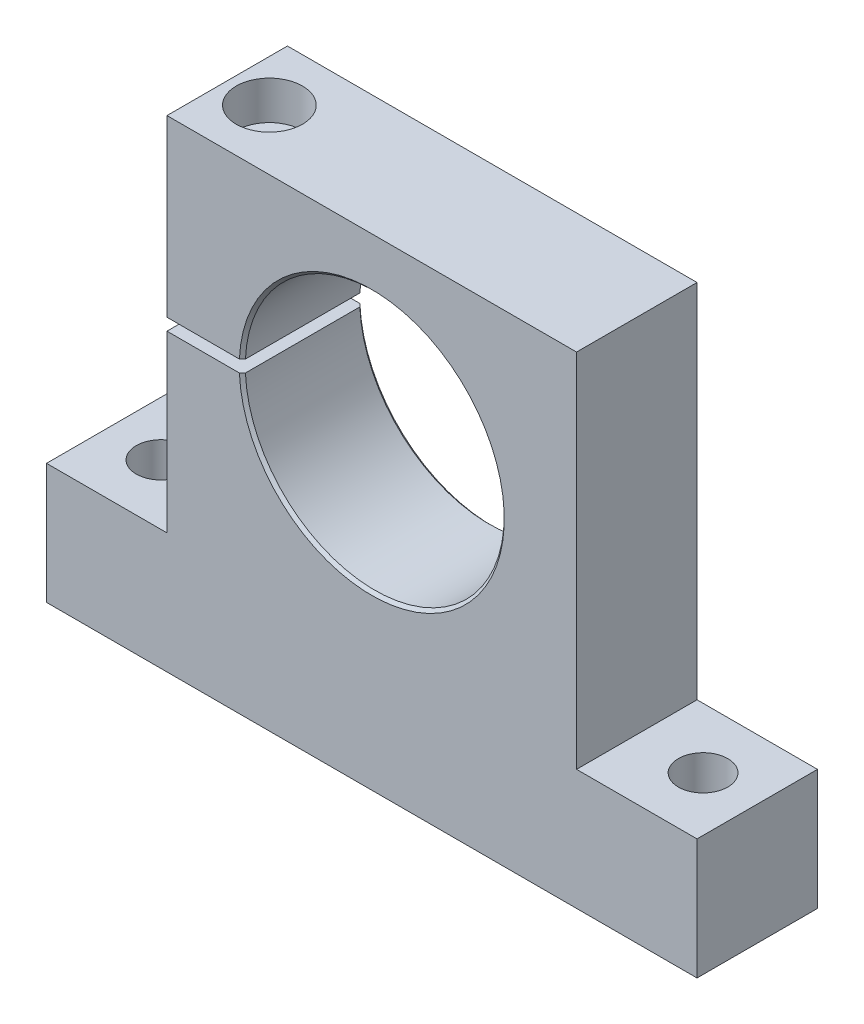
ISO-10303-21;
HEADER;
FILE_DESCRIPTION(('STEP AP214'),'2;1');
FILE_NAME('part.step','',(''),(''),'','','');
FILE_SCHEMA(('AUTOMOTIVE_DESIGN { 1 0 10303 214 1 1 1 1 }'));
ENDSEC;
DATA;
#1=APPLICATION_CONTEXT('core data for automotive mechanical design processes');
#2=APPLICATION_PROTOCOL_DEFINITION('international standard','automotive_design',2000,#1);
#3=PRODUCT_CONTEXT('',#1,'mechanical');
#4=PRODUCT('Part','Part','',(#3));
#5=PRODUCT_RELATED_PRODUCT_CATEGORY('part','',(#4));
#6=PRODUCT_DEFINITION_FORMATION('','',#4);
#7=PRODUCT_DEFINITION_CONTEXT('part definition',#1,'design');
#8=PRODUCT_DEFINITION('design','',#6,#7);
#9=PRODUCT_DEFINITION_SHAPE('','',#8);
#10=(LENGTH_UNIT() NAMED_UNIT(*) SI_UNIT(.MILLI.,.METRE.));
#11=(NAMED_UNIT(*) PLANE_ANGLE_UNIT() SI_UNIT($,.RADIAN.));
#12=(NAMED_UNIT(*) SI_UNIT($,.STERADIAN.) SOLID_ANGLE_UNIT());
#13=UNCERTAINTY_MEASURE_WITH_UNIT(LENGTH_MEASURE(1.E-05),#10,'distance_accuracy_value','');
#14=(GEOMETRIC_REPRESENTATION_CONTEXT(3) GLOBAL_UNCERTAINTY_ASSIGNED_CONTEXT((#13)) GLOBAL_UNIT_ASSIGNED_CONTEXT((#10,
#11,#12)) REPRESENTATION_CONTEXT('',''));
#15=CARTESIAN_POINT('',(0.,0.,0.));
#16=DIRECTION('',(0.,0.,1.));
#17=DIRECTION('',(1.,0.,0.));
#18=AXIS2_PLACEMENT_3D('',#15,#16,#17);
#19=CARTESIAN_POINT('',(20.,20.,20.));
#20=DIRECTION('',(1.,0.,0.));
#21=DIRECTION('',(0.,0.,-1.));
#22=AXIS2_PLACEMENT_3D('',#19,#20,#21);
#23=PLANE('',#22);
#24=DIRECTION('',(0.,-1.,0.));
#25=VECTOR('',#24,1.);
#26=CARTESIAN_POINT('',(20.,20.,0.));
#27=LINE('',#26,#25);
#28=CARTESIAN_POINT('',(20.,80.,0.));
#29=VERTEX_POINT('',#28);
#30=CARTESIAN_POINT('',(20.,51.,0.));
#31=VERTEX_POINT('',#30);
#32=EDGE_CURVE('E165',#29,#31,#27,.T.);
#33=ORIENTED_EDGE('',*,*,#32,.T.);
#34=DIRECTION('',(0.,0.,1.));
#35=VECTOR('',#34,1.);
#36=CARTESIAN_POINT('',(20.,51.,20.));
#37=LINE('',#36,#35);
#38=CARTESIAN_POINT('',(20.,51.,20.));
#39=VERTEX_POINT('',#38);
#40=EDGE_CURVE('E249',#31,#39,#37,.T.);
#41=ORIENTED_EDGE('',*,*,#40,.T.);
#42=DIRECTION('',(0.,-1.,0.));
#43=VECTOR('',#42,1.);
#44=CARTESIAN_POINT('',(20.,20.,20.));
#45=LINE('',#44,#43);
#46=CARTESIAN_POINT('',(20.,80.,20.));
#47=VERTEX_POINT('',#46);
#48=EDGE_CURVE('E295',#47,#39,#45,.T.);
#49=ORIENTED_EDGE('',*,*,#48,.F.);
#50=DIRECTION('',(0.,0.,-1.));
#51=VECTOR('',#50,1.);
#52=CARTESIAN_POINT('',(20.,80.,20.));
#53=LINE('',#52,#51);
#54=EDGE_CURVE('E181',#47,#29,#53,.T.);
#55=ORIENTED_EDGE('',*,*,#54,.T.);
#56=EDGE_LOOP('',(#33,#41,#49,#55));
#57=FACE_BOUND('',#56,.T.);
#58=ADVANCED_FACE('F32',(#57),#23,.F.);
#59=CARTESIAN_POINT('',(27.,80.,10.));
#60=DIRECTION('',(0.,1.,0.));
#61=DIRECTION('',(0.,0.,1.));
#62=AXIS2_PLACEMENT_3D('',#59,#60,#61);
#63=CYLINDRICAL_SURFACE('',#62,3.29999999999999);
#64=CARTESIAN_POINT('',(27.,51.,10.));
#65=DIRECTION('',(0.,1.,0.));
#66=DIRECTION('',(0.,0.,1.));
#67=AXIS2_PLACEMENT_3D('',#64,#65,#66);
#68=CIRCLE('',#67,3.29999999999999);
#69=CARTESIAN_POINT('',(27.,51.,13.3));
#70=VERTEX_POINT('',#69);
#71=EDGE_CURVE('E158',#70,#70,#68,.F.);
#72=ORIENTED_EDGE('',*,*,#71,.T.);
#73=EDGE_LOOP('',(#72));
#74=FACE_BOUND('',#73,.T.);
#75=CARTESIAN_POINT('',(27.,73.6,10.));
#76=DIRECTION('',(0.,1.,0.));
#77=DIRECTION('',(0.,0.,1.));
#78=AXIS2_PLACEMENT_3D('',#75,#76,#77);
#79=CIRCLE('',#78,3.29999999999999);
#80=CARTESIAN_POINT('',(27.,73.6,13.3));
#81=VERTEX_POINT('',#80);
#82=EDGE_CURVE('E264',#81,#81,#79,.T.);
#83=ORIENTED_EDGE('',*,*,#82,.T.);
#84=EDGE_LOOP('',(#83));
#85=FACE_BOUND('',#84,.T.);
#86=ADVANCED_FACE('F348',(#74,#85),#63,.F.);
#87=CARTESIAN_POINT('',(0.,0.,20.));
#88=DIRECTION('',(0.,0.,-1.));
#89=DIRECTION('',(-1.,0.,0.));
#90=AXIS2_PLACEMENT_3D('',#87,#88,#89);
#91=PLANE('',#90);
#92=DIRECTION('',(1.,0.,0.));
#93=VECTOR('',#92,1.);
#94=CARTESIAN_POINT('',(19.9047146945495,51.,20.));
#95=LINE('',#94,#93);
#96=CARTESIAN_POINT('',(32.0227390241641,51.,20.));
#97=VERTEX_POINT('',#96);
#98=EDGE_CURVE('E203',#39,#97,#95,.T.);
#99=ORIENTED_EDGE('',*,*,#98,.T.);
#100=CARTESIAN_POINT('',(54.,50.,20.));
#101=DIRECTION('',(0.,0.,-1.));
#102=DIRECTION('',(-1.,0.,0.));
#103=AXIS2_PLACEMENT_3D('',#100,#101,#102);
#104=CIRCLE('',#103,22.);
#105=CARTESIAN_POINT('',(32.0227390241641,49.,20.));
#106=VERTEX_POINT('',#105);
#107=EDGE_CURVE('E45',#97,#106,#104,.T.);
#108=ORIENTED_EDGE('',*,*,#107,.T.);
#109=DIRECTION('',(-1.,0.,0.));
#110=VECTOR('',#109,1.);
#111=CARTESIAN_POINT('',(19.9047146945495,49.,20.));
#112=LINE('',#111,#110);
#113=CARTESIAN_POINT('',(20.,49.,20.));
#114=VERTEX_POINT('',#113);
#115=EDGE_CURVE('E250',#106,#114,#112,.T.);
#116=ORIENTED_EDGE('',*,*,#115,.T.);
#117=CARTESIAN_POINT('',(20.,20.,20.));
#118=VERTEX_POINT('',#117);
#119=EDGE_CURVE('E157',#114,#118,#45,.T.);
#120=ORIENTED_EDGE('',*,*,#119,.T.);
#121=DIRECTION('',(-1.,0.,0.));
#122=VECTOR('',#121,1.);
#123=CARTESIAN_POINT('',(0.,20.,20.));
#124=LINE('',#123,#122);
#125=CARTESIAN_POINT('',(0.,20.,20.));
#126=VERTEX_POINT('',#125);
#127=EDGE_CURVE('E179',#118,#126,#124,.T.);
#128=ORIENTED_EDGE('',*,*,#127,.T.);
#129=DIRECTION('',(0.,-1.,0.));
#130=VECTOR('',#129,1.);
#131=CARTESIAN_POINT('',(0.,0.,20.));
#132=LINE('',#131,#130);
#133=CARTESIAN_POINT('',(0.,0.,20.));
#134=VERTEX_POINT('',#133);
#135=EDGE_CURVE('E174',#126,#134,#132,.T.);
#136=ORIENTED_EDGE('',*,*,#135,.T.);
#137=DIRECTION('',(1.,0.,0.));
#138=VECTOR('',#137,1.);
#139=CARTESIAN_POINT('',(0.,0.,20.));
#140=LINE('',#139,#138);
#141=CARTESIAN_POINT('',(108.,0.,20.));
#142=VERTEX_POINT('',#141);
#143=EDGE_CURVE('E285',#134,#142,#140,.T.);
#144=ORIENTED_EDGE('',*,*,#143,.T.);
#145=DIRECTION('',(0.,1.,0.));
#146=VECTOR('',#145,1.);
#147=CARTESIAN_POINT('',(108.,0.,20.));
#148=LINE('',#147,#146);
#149=CARTESIAN_POINT('',(108.,20.,20.));
#150=VERTEX_POINT('',#149);
#151=EDGE_CURVE('E287',#142,#150,#148,.T.);
#152=ORIENTED_EDGE('',*,*,#151,.T.);
#153=DIRECTION('',(-1.,0.,0.));
#154=VECTOR('',#153,1.);
#155=CARTESIAN_POINT('',(108.,20.,20.));
#156=LINE('',#155,#154);
#157=CARTESIAN_POINT('',(88.,20.,20.));
#158=VERTEX_POINT('',#157);
#159=EDGE_CURVE('E289',#150,#158,#156,.T.);
#160=ORIENTED_EDGE('',*,*,#159,.T.);
#161=DIRECTION('',(0.,1.,0.));
#162=VECTOR('',#161,1.);
#163=CARTESIAN_POINT('',(88.,20.,20.));
#164=LINE('',#163,#162);
#165=CARTESIAN_POINT('',(88.,80.,20.));
#166=VERTEX_POINT('',#165);
#167=EDGE_CURVE('E291',#158,#166,#164,.T.);
#168=ORIENTED_EDGE('',*,*,#167,.T.);
#169=DIRECTION('',(-1.,0.,0.));
#170=VECTOR('',#169,1.);
#171=CARTESIAN_POINT('',(20.,80.,20.));
#172=LINE('',#171,#170);
#173=EDGE_CURVE('E293',#166,#47,#172,.T.);
#174=ORIENTED_EDGE('',*,*,#173,.T.);
#175=ORIENTED_EDGE('',*,*,#48,.T.);
#176=EDGE_LOOP('',(#99,#108,#116,#120,#128,#136,#144,#152,#160,#168,#174,#175));
#177=FACE_BOUND('',#176,.T.);
#178=ADVANCED_FACE('F320',(#177),#91,.F.);
#179=CARTESIAN_POINT('',(0.,0.,0.));
#180=DIRECTION('',(0.,0.,-1.));
#181=DIRECTION('',(-1.,0.,0.));
#182=AXIS2_PLACEMENT_3D('',#179,#180,#181);
#183=PLANE('',#182);
#184=DIRECTION('',(-1.,0.,0.));
#185=VECTOR('',#184,1.);
#186=CARTESIAN_POINT('',(19.9047146945495,49.,0.));
#187=LINE('',#186,#185);
#188=CARTESIAN_POINT('',(32.0227390241641,49.,0.));
#189=VERTEX_POINT('',#188);
#190=CARTESIAN_POINT('',(20.,49.,0.));
#191=VERTEX_POINT('',#190);
#192=EDGE_CURVE('E139',#189,#191,#187,.T.);
#193=ORIENTED_EDGE('',*,*,#192,.F.);
#194=CARTESIAN_POINT('',(54.,50.,0.));
#195=DIRECTION('',(0.,0.,-1.));
#196=DIRECTION('',(-1.,0.,0.));
#197=AXIS2_PLACEMENT_3D('',#194,#195,#196);
#198=CIRCLE('',#197,22.);
#199=CARTESIAN_POINT('',(32.0227390241641,51.,0.));
#200=VERTEX_POINT('',#199);
#201=EDGE_CURVE('E199',#189,#200,#198,.F.);
#202=ORIENTED_EDGE('',*,*,#201,.T.);
#203=DIRECTION('',(1.,0.,0.));
#204=VECTOR('',#203,1.);
#205=CARTESIAN_POINT('',(19.9047146945495,51.,0.));
#206=LINE('',#205,#204);
#207=EDGE_CURVE('E150',#31,#200,#206,.T.);
#208=ORIENTED_EDGE('',*,*,#207,.F.);
#209=ORIENTED_EDGE('',*,*,#32,.F.);
#210=DIRECTION('',(-1.,0.,0.));
#211=VECTOR('',#210,1.);
#212=CARTESIAN_POINT('',(20.,80.,0.));
#213=LINE('',#212,#211);
#214=CARTESIAN_POINT('',(88.,80.,0.));
#215=VERTEX_POINT('',#214);
#216=EDGE_CURVE('E166',#215,#29,#213,.T.);
#217=ORIENTED_EDGE('',*,*,#216,.F.);
#218=DIRECTION('',(0.,1.,0.));
#219=VECTOR('',#218,1.);
#220=CARTESIAN_POINT('',(88.,20.,0.));
#221=LINE('',#220,#219);
#222=CARTESIAN_POINT('',(88.,20.,0.));
#223=VERTEX_POINT('',#222);
#224=EDGE_CURVE('E169',#223,#215,#221,.T.);
#225=ORIENTED_EDGE('',*,*,#224,.F.);
#226=DIRECTION('',(-1.,0.,0.));
#227=VECTOR('',#226,1.);
#228=CARTESIAN_POINT('',(108.,20.,0.));
#229=LINE('',#228,#227);
#230=CARTESIAN_POINT('',(108.,20.,0.));
#231=VERTEX_POINT('',#230);
#232=EDGE_CURVE('E305',#231,#223,#229,.T.);
#233=ORIENTED_EDGE('',*,*,#232,.F.);
#234=DIRECTION('',(0.,1.,0.));
#235=VECTOR('',#234,1.);
#236=CARTESIAN_POINT('',(108.,0.,0.));
#237=LINE('',#236,#235);
#238=CARTESIAN_POINT('',(108.,0.,0.));
#239=VERTEX_POINT('',#238);
#240=EDGE_CURVE('E303',#239,#231,#237,.T.);
#241=ORIENTED_EDGE('',*,*,#240,.F.);
#242=DIRECTION('',(1.,0.,0.));
#243=VECTOR('',#242,1.);
#244=CARTESIAN_POINT('',(0.,0.,0.));
#245=LINE('',#244,#243);
#246=CARTESIAN_POINT('',(0.,0.,0.));
#247=VERTEX_POINT('',#246);
#248=EDGE_CURVE('E301',#247,#239,#245,.T.);
#249=ORIENTED_EDGE('',*,*,#248,.F.);
#250=DIRECTION('',(0.,-1.,0.));
#251=VECTOR('',#250,1.);
#252=CARTESIAN_POINT('',(0.,0.,0.));
#253=LINE('',#252,#251);
#254=CARTESIAN_POINT('',(0.,20.,0.));
#255=VERTEX_POINT('',#254);
#256=EDGE_CURVE('E282',#255,#247,#253,.T.);
#257=ORIENTED_EDGE('',*,*,#256,.F.);
#258=DIRECTION('',(-1.,0.,0.));
#259=VECTOR('',#258,1.);
#260=CARTESIAN_POINT('',(0.,20.,0.));
#261=LINE('',#260,#259);
#262=CARTESIAN_POINT('',(20.,20.,0.));
#263=VERTEX_POINT('',#262);
#264=EDGE_CURVE('E164',#263,#255,#261,.T.);
#265=ORIENTED_EDGE('',*,*,#264,.F.);
#266=EDGE_CURVE('E155',#191,#263,#27,.T.);
#267=ORIENTED_EDGE('',*,*,#266,.F.);
#268=EDGE_LOOP('',(#193,#202,#208,#209,#217,#225,#233,#241,#249,#257,#265,#267));
#269=FACE_BOUND('',#268,.T.);
#270=ADVANCED_FACE('F162',(#269),#183,.T.);
#271=CARTESIAN_POINT('',(0.,0.,20.));
#272=DIRECTION('',(1.,0.,0.));
#273=DIRECTION('',(0.,0.,-1.));
#274=AXIS2_PLACEMENT_3D('',#271,#272,#273);
#275=PLANE('',#274);
#276=ORIENTED_EDGE('',*,*,#256,.T.);
#277=DIRECTION('',(0.,0.,-1.));
#278=VECTOR('',#277,1.);
#279=CARTESIAN_POINT('',(0.,0.,20.));
#280=LINE('',#279,#278);
#281=EDGE_CURVE('E196',#134,#247,#280,.T.);
#282=ORIENTED_EDGE('',*,*,#281,.F.);
#283=ORIENTED_EDGE('',*,*,#135,.F.);
#284=DIRECTION('',(0.,0.,-1.));
#285=VECTOR('',#284,1.);
#286=CARTESIAN_POINT('',(0.,20.,20.));
#287=LINE('',#286,#285);
#288=EDGE_CURVE('E175',#126,#255,#287,.T.);
#289=ORIENTED_EDGE('',*,*,#288,.T.);
#290=EDGE_LOOP('',(#276,#282,#283,#289));
#291=FACE_BOUND('',#290,.T.);
#292=ADVANCED_FACE('F335',(#291),#275,.F.);
#293=CARTESIAN_POINT('',(0.,0.,20.));
#294=DIRECTION('',(0.,1.,0.));
#295=DIRECTION('',(0.,0.,1.));
#296=AXIS2_PLACEMENT_3D('',#293,#294,#295);
#297=PLANE('',#296);
#298=CARTESIAN_POINT('',(8.99999999999999,0.,10.));
#299=DIRECTION('',(0.,1.,0.));
#300=DIRECTION('',(0.,0.,1.));
#301=AXIS2_PLACEMENT_3D('',#298,#299,#300);
#302=CIRCLE('',#301,4.09999999999999);
#303=CARTESIAN_POINT('',(8.99999999999999,0.,14.1));
#304=VERTEX_POINT('',#303);
#305=EDGE_CURVE('E273',#304,#304,#302,.T.);
#306=ORIENTED_EDGE('',*,*,#305,.T.);
#307=EDGE_LOOP('',(#306));
#308=FACE_BOUND('',#307,.T.);
#309=CARTESIAN_POINT('',(99.,0.,9.99999999999999));
#310=DIRECTION('',(0.,1.,0.));
#311=DIRECTION('',(0.,0.,1.));
#312=AXIS2_PLACEMENT_3D('',#309,#310,#311);
#313=CIRCLE('',#312,4.09999999999999);
#314=CARTESIAN_POINT('',(99.,0.,14.1));
#315=VERTEX_POINT('',#314);
#316=EDGE_CURVE('E279',#315,#315,#313,.T.);
#317=ORIENTED_EDGE('',*,*,#316,.T.);
#318=EDGE_LOOP('',(#317));
#319=FACE_BOUND('',#318,.T.);
#320=ORIENTED_EDGE('',*,*,#248,.T.);
#321=DIRECTION('',(0.,0.,-1.));
#322=VECTOR('',#321,1.);
#323=CARTESIAN_POINT('',(108.,0.,20.));
#324=LINE('',#323,#322);
#325=EDGE_CURVE('E193',#142,#239,#324,.T.);
#326=ORIENTED_EDGE('',*,*,#325,.F.);
#327=ORIENTED_EDGE('',*,*,#143,.F.);
#328=ORIENTED_EDGE('',*,*,#281,.T.);
#329=EDGE_LOOP('',(#320,#326,#327,#328));
#330=FACE_BOUND('',#329,.T.);
#331=ADVANCED_FACE('F331',(#308,#319,#330),#297,.F.);
#332=CARTESIAN_POINT('',(108.,0.,20.));
#333=DIRECTION('',(-1.,0.,0.));
#334=DIRECTION('',(0.,0.,1.));
#335=AXIS2_PLACEMENT_3D('',#332,#333,#334);
#336=PLANE('',#335);
#337=ORIENTED_EDGE('',*,*,#240,.T.);
#338=DIRECTION('',(0.,0.,-1.));
#339=VECTOR('',#338,1.);
#340=CARTESIAN_POINT('',(108.,20.,20.));
#341=LINE('',#340,#339);
#342=EDGE_CURVE('E190',#150,#231,#341,.T.);
#343=ORIENTED_EDGE('',*,*,#342,.F.);
#344=ORIENTED_EDGE('',*,*,#151,.F.);
#345=ORIENTED_EDGE('',*,*,#325,.T.);
#346=EDGE_LOOP('',(#337,#343,#344,#345));
#347=FACE_BOUND('',#346,.T.);
#348=ADVANCED_FACE('F328',(#347),#336,.F.);
#349=CARTESIAN_POINT('',(108.,20.,20.));
#350=DIRECTION('',(0.,-1.,0.));
#351=DIRECTION('',(0.,0.,-1.));
#352=AXIS2_PLACEMENT_3D('',#349,#350,#351);
#353=PLANE('',#352);
#354=CARTESIAN_POINT('',(99.,20.,9.99999999999999));
#355=DIRECTION('',(0.,1.,0.));
#356=DIRECTION('',(0.,0.,1.));
#357=AXIS2_PLACEMENT_3D('',#354,#355,#356);
#358=CIRCLE('',#357,4.09999999999999);
#359=CARTESIAN_POINT('',(99.,20.,14.1));
#360=VERTEX_POINT('',#359);
#361=EDGE_CURVE('E276',#360,#360,#358,.T.);
#362=ORIENTED_EDGE('',*,*,#361,.F.);
#363=EDGE_LOOP('',(#362));
#364=FACE_BOUND('',#363,.T.);
#365=ORIENTED_EDGE('',*,*,#232,.T.);
#366=DIRECTION('',(0.,0.,-1.));
#367=VECTOR('',#366,1.);
#368=CARTESIAN_POINT('',(88.,20.,20.));
#369=LINE('',#368,#367);
#370=EDGE_CURVE('E187',#158,#223,#369,.T.);
#371=ORIENTED_EDGE('',*,*,#370,.F.);
#372=ORIENTED_EDGE('',*,*,#159,.F.);
#373=ORIENTED_EDGE('',*,*,#342,.T.);
#374=EDGE_LOOP('',(#365,#371,#372,#373));
#375=FACE_BOUND('',#374,.T.);
#376=ADVANCED_FACE('F325',(#364,#375),#353,.F.);
#377=CARTESIAN_POINT('',(88.,20.,20.));
#378=DIRECTION('',(-1.,0.,0.));
#379=DIRECTION('',(0.,0.,1.));
#380=AXIS2_PLACEMENT_3D('',#377,#378,#379);
#381=PLANE('',#380);
#382=ORIENTED_EDGE('',*,*,#224,.T.);
#383=DIRECTION('',(0.,0.,-1.));
#384=VECTOR('',#383,1.);
#385=CARTESIAN_POINT('',(88.,80.,20.));
#386=LINE('',#385,#384);
#387=EDGE_CURVE('E184',#166,#215,#386,.T.);
#388=ORIENTED_EDGE('',*,*,#387,.F.);
#389=ORIENTED_EDGE('',*,*,#167,.F.);
#390=ORIENTED_EDGE('',*,*,#370,.T.);
#391=EDGE_LOOP('',(#382,#388,#389,#390));
#392=FACE_BOUND('',#391,.T.);
#393=ADVANCED_FACE('F309',(#392),#381,.F.);
#394=CARTESIAN_POINT('',(20.,80.,20.));
#395=DIRECTION('',(0.,-1.,0.));
#396=DIRECTION('',(0.,0.,-1.));
#397=AXIS2_PLACEMENT_3D('',#394,#395,#396);
#398=PLANE('',#397);
#399=CARTESIAN_POINT('',(27.,80.,10.));
#400=DIRECTION('',(0.,1.,0.));
#401=DIRECTION('',(0.,0.,1.));
#402=AXIS2_PLACEMENT_3D('',#399,#400,#401);
#403=CIRCLE('',#402,5.5);
#404=CARTESIAN_POINT('',(27.,80.,15.5));
#405=VERTEX_POINT('',#404);
#406=EDGE_CURVE('E258',#405,#405,#403,.T.);
#407=ORIENTED_EDGE('',*,*,#406,.F.);
#408=EDGE_LOOP('',(#407));
#409=FACE_BOUND('',#408,.T.);
#410=ORIENTED_EDGE('',*,*,#216,.T.);
#411=ORIENTED_EDGE('',*,*,#54,.F.);
#412=ORIENTED_EDGE('',*,*,#173,.F.);
#413=ORIENTED_EDGE('',*,*,#387,.T.);
#414=EDGE_LOOP('',(#410,#411,#412,#413));
#415=FACE_BOUND('',#414,.T.);
#416=ADVANCED_FACE('F316',(#409,#415),#398,.F.);
#417=ORIENTED_EDGE('',*,*,#119,.F.);
#418=DIRECTION('',(0.,0.,-1.));
#419=VECTOR('',#418,1.);
#420=CARTESIAN_POINT('',(20.,49.,20.));
#421=LINE('',#420,#419);
#422=EDGE_CURVE('E142',#114,#191,#421,.T.);
#423=ORIENTED_EDGE('',*,*,#422,.T.);
#424=ORIENTED_EDGE('',*,*,#266,.T.);
#425=DIRECTION('',(0.,0.,-1.));
#426=VECTOR('',#425,1.);
#427=CARTESIAN_POINT('',(20.,20.,20.));
#428=LINE('',#427,#426);
#429=EDGE_CURVE('E178',#118,#263,#428,.T.);
#430=ORIENTED_EDGE('',*,*,#429,.F.);
#431=EDGE_LOOP('',(#417,#423,#424,#430));
#432=FACE_BOUND('',#431,.T.);
#433=ADVANCED_FACE('F153',(#432),#23,.F.);
#434=CARTESIAN_POINT('',(0.,20.,20.));
#435=DIRECTION('',(0.,-1.,0.));
#436=DIRECTION('',(0.,0.,-1.));
#437=AXIS2_PLACEMENT_3D('',#434,#435,#436);
#438=PLANE('',#437);
#439=CARTESIAN_POINT('',(8.99999999999999,20.,10.));
#440=DIRECTION('',(0.,1.,0.));
#441=DIRECTION('',(0.,0.,1.));
#442=AXIS2_PLACEMENT_3D('',#439,#440,#441);
#443=CIRCLE('',#442,4.1);
#444=CARTESIAN_POINT('',(8.99999999999999,20.,14.1));
#445=VERTEX_POINT('',#444);
#446=EDGE_CURVE('E270',#445,#445,#443,.T.);
#447=ORIENTED_EDGE('',*,*,#446,.F.);
#448=EDGE_LOOP('',(#447));
#449=FACE_BOUND('',#448,.T.);
#450=ORIENTED_EDGE('',*,*,#264,.T.);
#451=ORIENTED_EDGE('',*,*,#288,.F.);
#452=ORIENTED_EDGE('',*,*,#127,.F.);
#453=ORIENTED_EDGE('',*,*,#429,.T.);
#454=EDGE_LOOP('',(#450,#451,#452,#453));
#455=FACE_BOUND('',#454,.T.);
#456=ADVANCED_FACE('F339',(#449,#455),#438,.F.);
#457=CARTESIAN_POINT('',(54.,50.,20.));
#458=DIRECTION('',(0.,0.,-1.));
#459=DIRECTION('',(-1.,0.,0.));
#460=AXIS2_PLACEMENT_3D('',#457,#458,#459);
#461=CYLINDRICAL_SURFACE('',#460,21.5);
#462=DIRECTION('',(0.,0.,-1.));
#463=VECTOR('',#462,1.);
#464=CARTESIAN_POINT('',(32.5232684050855,49.,20.));
#465=LINE('',#464,#463);
#466=CARTESIAN_POINT('',(32.5232684050855,49.,19.5));
#467=VERTEX_POINT('',#466);
#468=CARTESIAN_POINT('',(32.5232684050855,49.,0.500000000000015));
#469=VERTEX_POINT('',#468);
#470=EDGE_CURVE('E159',#467,#469,#465,.T.);
#471=ORIENTED_EDGE('',*,*,#470,.F.);
#472=CARTESIAN_POINT('',(54.,50.,19.5));
#473=DIRECTION('',(0.,0.,-1.));
#474=DIRECTION('',(-1.,0.,0.));
#475=AXIS2_PLACEMENT_3D('',#472,#473,#474);
#476=CIRCLE('',#475,21.5);
#477=CARTESIAN_POINT('',(32.5232684050855,51.,19.5));
#478=VERTEX_POINT('',#477);
#479=EDGE_CURVE('E232',#467,#478,#476,.F.);
#480=ORIENTED_EDGE('',*,*,#479,.T.);
#481=DIRECTION('',(0.,0.,-1.));
#482=VECTOR('',#481,1.);
#483=CARTESIAN_POINT('',(32.5232684050855,51.,20.));
#484=LINE('',#483,#482);
#485=CARTESIAN_POINT('',(32.5232684050855,51.,0.500000000000014));
#486=VERTEX_POINT('',#485);
#487=EDGE_CURVE('E206',#486,#478,#484,.F.);
#488=ORIENTED_EDGE('',*,*,#487,.F.);
#489=CARTESIAN_POINT('',(54.,50.,0.500000000000014));
#490=DIRECTION('',(0.,0.,-1.));
#491=DIRECTION('',(-1.,0.,0.));
#492=AXIS2_PLACEMENT_3D('',#489,#490,#491);
#493=CIRCLE('',#492,21.5);
#494=EDGE_CURVE('E214',#486,#469,#493,.T.);
#495=ORIENTED_EDGE('',*,*,#494,.T.);
#496=EDGE_LOOP('',(#471,#480,#488,#495));
#497=FACE_BOUND('',#496,.T.);
#498=ADVANCED_FACE('F242',(#497),#461,.F.);
#499=CARTESIAN_POINT('',(99.,20.,9.99999999999999));
#500=DIRECTION('',(0.,1.,0.));
#501=DIRECTION('',(0.,0.,1.));
#502=AXIS2_PLACEMENT_3D('',#499,#500,#501);
#503=CYLINDRICAL_SURFACE('',#502,4.09999999999999);
#504=ORIENTED_EDGE('',*,*,#316,.F.);
#505=EDGE_LOOP('',(#504));
#506=FACE_BOUND('',#505,.T.);
#507=ORIENTED_EDGE('',*,*,#361,.T.);
#508=EDGE_LOOP('',(#507));
#509=FACE_BOUND('',#508,.T.);
#510=ADVANCED_FACE('F389',(#506,#509),#503,.F.);
#511=CARTESIAN_POINT('',(8.99999999999999,20.,10.));
#512=DIRECTION('',(0.,1.,0.));
#513=DIRECTION('',(0.,0.,1.));
#514=AXIS2_PLACEMENT_3D('',#511,#512,#513);
#515=CYLINDRICAL_SURFACE('',#514,4.1);
#516=ORIENTED_EDGE('',*,*,#305,.F.);
#517=EDGE_LOOP('',(#516));
#518=FACE_BOUND('',#517,.T.);
#519=ORIENTED_EDGE('',*,*,#446,.T.);
#520=EDGE_LOOP('',(#519));
#521=FACE_BOUND('',#520,.T.);
#522=ADVANCED_FACE('F392',(#518,#521),#515,.F.);
#523=CARTESIAN_POINT('',(30.3,73.6,10.));
#524=DIRECTION('',(0.,-1.,0.));
#525=DIRECTION('',(0.,0.,-1.));
#526=AXIS2_PLACEMENT_3D('',#523,#524,#525);
#527=PLANE('',#526);
#528=ORIENTED_EDGE('',*,*,#82,.F.);
#529=EDGE_LOOP('',(#528));
#530=FACE_BOUND('',#529,.T.);
#531=CARTESIAN_POINT('',(27.,73.6,10.));
#532=DIRECTION('',(0.,1.,0.));
#533=DIRECTION('',(0.,0.,1.));
#534=AXIS2_PLACEMENT_3D('',#531,#532,#533);
#535=CIRCLE('',#534,5.5);
#536=CARTESIAN_POINT('',(27.,73.6,15.5));
#537=VERTEX_POINT('',#536);
#538=EDGE_CURVE('E261',#537,#537,#535,.T.);
#539=ORIENTED_EDGE('',*,*,#538,.T.);
#540=EDGE_LOOP('',(#539));
#541=FACE_BOUND('',#540,.T.);
#542=ADVANCED_FACE('F396',(#530,#541),#527,.F.);
#543=CARTESIAN_POINT('',(27.,80.,10.));
#544=DIRECTION('',(0.,1.,0.));
#545=DIRECTION('',(0.,0.,1.));
#546=AXIS2_PLACEMENT_3D('',#543,#544,#545);
#547=CYLINDRICAL_SURFACE('',#546,5.5);
#548=ORIENTED_EDGE('',*,*,#538,.F.);
#549=EDGE_LOOP('',(#548));
#550=FACE_BOUND('',#549,.T.);
#551=ORIENTED_EDGE('',*,*,#406,.T.);
#552=EDGE_LOOP('',(#551));
#553=FACE_BOUND('',#552,.T.);
#554=ADVANCED_FACE('F404',(#550,#553),#547,.F.);
#555=CARTESIAN_POINT('',(19.9047146945495,49.,20.));
#556=DIRECTION('',(0.,-1.,0.));
#557=DIRECTION('',(0.,0.,-1.));
#558=AXIS2_PLACEMENT_3D('',#555,#556,#557);
#559=PLANE('',#558);
#560=CARTESIAN_POINT('',(27.,49.,10.));
#561=DIRECTION('',(0.,-1.,0.));
#562=DIRECTION('',(0.,0.,-1.));
#563=AXIS2_PLACEMENT_3D('',#560,#561,#562);
#564=CIRCLE('',#563,3.29999999999999);
#565=CARTESIAN_POINT('',(27.,49.,6.70000000000001));
#566=VERTEX_POINT('',#565);
#567=EDGE_CURVE('E200',#566,#566,#564,.F.);
#568=ORIENTED_EDGE('',*,*,#567,.F.);
#569=EDGE_LOOP('',(#568));
#570=FACE_BOUND('',#569,.T.);
#571=ORIENTED_EDGE('',*,*,#115,.F.);
#572=CARTESIAN_POINT('',(32.0227390241641,49.,20.));
#573=CARTESIAN_POINT('',(32.106159572975,49.,19.9166656509164));
#574=CARTESIAN_POINT('',(32.1895806291238,49.,19.8333318097079));
#575=CARTESIAN_POINT('',(32.3564237560976,49.,19.6666651430413));
#576=CARTESIAN_POINT('',(32.4398458269226,49.,19.583332317583));
#577=CARTESIAN_POINT('',(32.5232684050855,49.,19.5));
#578=B_SPLINE_CURVE_WITH_KNOTS('',3,(#572,#573,#574,#575,#576,#577),.UNSPECIFIED.,.F.,.F.,(4,2,
4),(0.,0.353740604533799,0.707481209067901),.UNSPECIFIED.);
#579=EDGE_CURVE('E11',#106,#467,#578,.T.);
#580=ORIENTED_EDGE('',*,*,#579,.T.);
#581=ORIENTED_EDGE('',*,*,#470,.T.);
#582=CARTESIAN_POINT('',(32.5232684050855,49.,0.500000000000014));
#583=CARTESIAN_POINT('',(32.4398458269226,49.,0.416667682416938));
#584=CARTESIAN_POINT('',(32.3564237560976,49.,0.333334856958713));
#585=CARTESIAN_POINT('',(32.1895806291239,49.,0.166668190292042));
#586=CARTESIAN_POINT('',(32.106159572975,49.,0.0833343490835943));
#587=CARTESIAN_POINT('',(32.0227390241641,49.,0.));
#588=B_SPLINE_CURVE_WITH_KNOTS('',3,(#582,#583,#584,#585,#586,#587),.UNSPECIFIED.,.F.,.F.,(4,2,
4),(0.,0.35374060453408,0.707481209067858),.UNSPECIFIED.);
#589=EDGE_CURVE('E145',#469,#189,#588,.T.);
#590=ORIENTED_EDGE('',*,*,#589,.T.);
#591=ORIENTED_EDGE('',*,*,#192,.T.);
#592=ORIENTED_EDGE('',*,*,#422,.F.);
#593=EDGE_LOOP('',(#571,#580,#581,#590,#591,#592));
#594=FACE_BOUND('',#593,.T.);
#595=ADVANCED_FACE('F141',(#570,#594),#559,.F.);
#596=CARTESIAN_POINT('',(19.9047146945495,51.,20.));
#597=DIRECTION('',(0.,1.,0.));
#598=DIRECTION('',(0.,0.,1.));
#599=AXIS2_PLACEMENT_3D('',#596,#597,#598);
#600=PLANE('',#599);
#601=ORIENTED_EDGE('',*,*,#71,.F.);
#602=EDGE_LOOP('',(#601));
#603=FACE_BOUND('',#602,.T.);
#604=ORIENTED_EDGE('',*,*,#487,.T.);
#605=CARTESIAN_POINT('',(32.5232684050855,51.,19.5));
#606=CARTESIAN_POINT('',(32.4398458269226,51.,19.583332317583));
#607=CARTESIAN_POINT('',(32.3564237560976,51.,19.6666651430413));
#608=CARTESIAN_POINT('',(32.1895806291238,51.,19.8333318097079));
#609=CARTESIAN_POINT('',(32.106159572975,51.,19.9166656509164));
#610=CARTESIAN_POINT('',(32.0227390241641,51.,20.));
#611=B_SPLINE_CURVE_WITH_KNOTS('',3,(#605,#606,#607,#608,#609,#610),.UNSPECIFIED.,.F.,.F.,(4,2,
4),(0.,0.353740604534103,0.707481209067901),.UNSPECIFIED.);
#612=EDGE_CURVE('E59',#478,#97,#611,.T.);
#613=ORIENTED_EDGE('',*,*,#612,.T.);
#614=ORIENTED_EDGE('',*,*,#98,.F.);
#615=ORIENTED_EDGE('',*,*,#40,.F.);
#616=ORIENTED_EDGE('',*,*,#207,.T.);
#617=CARTESIAN_POINT('',(32.0227390241641,51.,0.));
#618=CARTESIAN_POINT('',(32.106159572975,51.,0.0833343490835952));
#619=CARTESIAN_POINT('',(32.1895806291239,51.,0.166668190292043));
#620=CARTESIAN_POINT('',(32.3564237560976,51.,0.333334856958714));
#621=CARTESIAN_POINT('',(32.4398458269226,51.,0.416667682416938));
#622=CARTESIAN_POINT('',(32.5232684050855,51.,0.500000000000014));
#623=B_SPLINE_CURVE_WITH_KNOTS('',3,(#617,#618,#619,#620,#621,#622),.UNSPECIFIED.,.F.,.F.,(4,2,
4),(0.,0.353740604533773,0.707481209067852),.UNSPECIFIED.);
#624=EDGE_CURVE('E208',#200,#486,#623,.T.);
#625=ORIENTED_EDGE('',*,*,#624,.T.);
#626=EDGE_LOOP('',(#604,#613,#614,#615,#616,#625));
#627=FACE_BOUND('',#626,.T.);
#628=ADVANCED_FACE('F219',(#603,#627),#600,.F.);
#629=CARTESIAN_POINT('',(27.,30.,10.));
#630=DIRECTION('',(0.,1.,0.));
#631=DIRECTION('',(0.,0.,1.));
#632=AXIS2_PLACEMENT_3D('',#629,#630,#631);
#633=CONICAL_SURFACE('',#632,3.29999999999999,1.02974425867665);
#634=CARTESIAN_POINT('',(27.,28.017159957209,10.));
#635=VERTEX_POINT('',#634);
#636=VERTEX_LOOP('',#635);
#637=FACE_BOUND('',#636,.T.);
#638=CARTESIAN_POINT('',(27.,30.,10.));
#639=DIRECTION('',(0.,1.,0.));
#640=DIRECTION('',(0.,0.,1.));
#641=AXIS2_PLACEMENT_3D('',#638,#639,#640);
#642=CIRCLE('',#641,3.29999999999999);
#643=CARTESIAN_POINT('',(27.,30.,13.3));
#644=VERTEX_POINT('',#643);
#645=EDGE_CURVE('E267',#644,#644,#642,.T.);
#646=ORIENTED_EDGE('',*,*,#645,.T.);
#647=EDGE_LOOP('',(#646));
#648=FACE_BOUND('',#647,.T.);
#649=ADVANCED_FACE('F222',(#637,#648),#633,.F.);
#650=ORIENTED_EDGE('',*,*,#567,.T.);
#651=EDGE_LOOP('',(#650));
#652=FACE_BOUND('',#651,.T.);
#653=ORIENTED_EDGE('',*,*,#645,.F.);
#654=EDGE_LOOP('',(#653));
#655=FACE_BOUND('',#654,.T.);
#656=ADVANCED_FACE('F346',(#652,#655),#63,.F.);
#657=CARTESIAN_POINT('',(54.,50.,0.));
#658=DIRECTION('',(0.,0.,-1.));
#659=DIRECTION('',(-1.,0.,0.));
#660=AXIS2_PLACEMENT_3D('',#657,#658,#659);
#661=CONICAL_SURFACE('',#660,22.,0.785398163397441);
#662=ORIENTED_EDGE('',*,*,#589,.F.);
#663=ORIENTED_EDGE('',*,*,#494,.F.);
#664=ORIENTED_EDGE('',*,*,#624,.F.);
#665=ORIENTED_EDGE('',*,*,#201,.F.);
#666=EDGE_LOOP('',(#662,#663,#664,#665));
#667=FACE_BOUND('',#666,.T.);
#668=ADVANCED_FACE('F216',(#667),#661,.F.);
#669=CARTESIAN_POINT('',(54.,50.,19.5));
#670=DIRECTION('',(0.,0.,1.));
#671=DIRECTION('',(1.,0.,0.));
#672=AXIS2_PLACEMENT_3D('',#669,#670,#671);
#673=CONICAL_SURFACE('',#672,21.5,0.785398163397434);
#674=ORIENTED_EDGE('',*,*,#579,.F.);
#675=ORIENTED_EDGE('',*,*,#107,.F.);
#676=ORIENTED_EDGE('',*,*,#612,.F.);
#677=ORIENTED_EDGE('',*,*,#479,.F.);
#678=EDGE_LOOP('',(#674,#675,#676,#677));
#679=FACE_BOUND('',#678,.T.);
#680=ADVANCED_FACE('F34',(#679),#673,.F.);
#681=CLOSED_SHELL('',(#58,#86,#178,#270,#292,#331,#348,#376,#393,#416,#433,#456,#498,#510,#522,
#542,#554,#595,#628,#649,#656,#668,#680));
#682=MANIFOLD_SOLID_BREP('B2',#681);
#683=ADVANCED_BREP_SHAPE_REPRESENTATION('',(#18,#682),#14);
#684=SHAPE_DEFINITION_REPRESENTATION(#9,#683);
ENDSEC;
END-ISO-10303-21;
